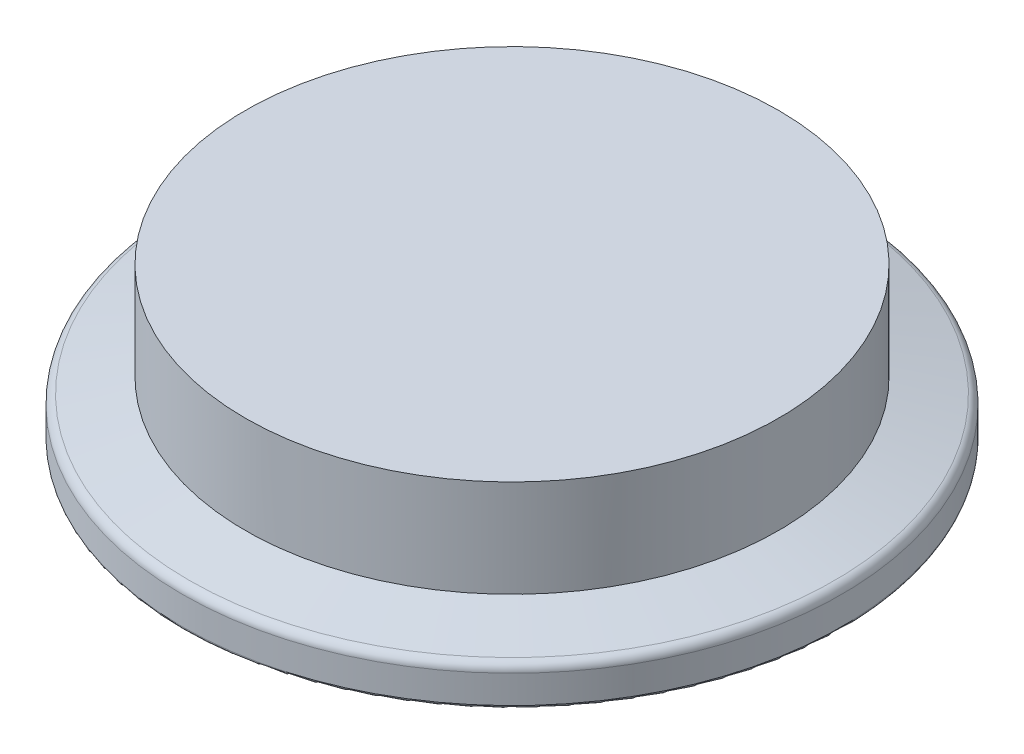
ISO-10303-21;
HEADER;
FILE_DESCRIPTION(('STEP AP214'),'2;1');
FILE_NAME('part.step','',(''),(''),'','','');
FILE_SCHEMA(('AUTOMOTIVE_DESIGN { 1 0 10303 214 1 1 1 1 }'));
ENDSEC;
DATA;
#1=APPLICATION_CONTEXT('core data for automotive mechanical design processes');
#2=APPLICATION_PROTOCOL_DEFINITION('international standard','automotive_design',2000,#1);
#3=PRODUCT_CONTEXT('',#1,'mechanical');
#4=PRODUCT('Part','Part','',(#3));
#5=PRODUCT_RELATED_PRODUCT_CATEGORY('part','',(#4));
#6=PRODUCT_DEFINITION_FORMATION('','',#4);
#7=PRODUCT_DEFINITION_CONTEXT('part definition',#1,'design');
#8=PRODUCT_DEFINITION('design','',#6,#7);
#9=PRODUCT_DEFINITION_SHAPE('','',#8);
#10=(LENGTH_UNIT() NAMED_UNIT(*) SI_UNIT(.MILLI.,.METRE.));
#11=(NAMED_UNIT(*) PLANE_ANGLE_UNIT() SI_UNIT($,.RADIAN.));
#12=(NAMED_UNIT(*) SI_UNIT($,.STERADIAN.) SOLID_ANGLE_UNIT());
#13=UNCERTAINTY_MEASURE_WITH_UNIT(LENGTH_MEASURE(1.E-05),#10,'distance_accuracy_value','');
#14=(GEOMETRIC_REPRESENTATION_CONTEXT(3) GLOBAL_UNCERTAINTY_ASSIGNED_CONTEXT((#13)) GLOBAL_UNIT_ASSIGNED_CONTEXT((#10,
#11,#12)) REPRESENTATION_CONTEXT('',''));
#15=CARTESIAN_POINT('',(0.,0.,0.));
#16=DIRECTION('',(0.,0.,1.));
#17=DIRECTION('',(1.,0.,0.));
#18=AXIS2_PLACEMENT_3D('',#15,#16,#17);
#19=CARTESIAN_POINT('',(0.,0.,20.625));
#20=DIRECTION('',(0.,1.,0.));
#21=DIRECTION('',(0.,0.,1.));
#22=AXIS2_PLACEMENT_3D('',#19,#20,#21);
#23=PLANE('',#22);
#24=CARTESIAN_POINT('',(0.,0.,0.));
#25=DIRECTION('',(0.,1.,0.));
#26=DIRECTION('',(0.,0.,1.));
#27=AXIS2_PLACEMENT_3D('',#24,#25,#26);
#28=CIRCLE('',#27,27.246);
#29=CARTESIAN_POINT('',(0.,0.,27.246));
#30=VERTEX_POINT('',#29);
#31=EDGE_CURVE('E43',#30,#30,#28,.F.);
#32=ORIENTED_EDGE('',*,*,#31,.T.);
#33=EDGE_LOOP('',(#32));
#34=FACE_BOUND('',#33,.T.);
#35=CARTESIAN_POINT('',(0.,0.,0.));
#36=DIRECTION('',(0.,-1.,0.));
#37=DIRECTION('',(0.,0.,-1.));
#38=AXIS2_PLACEMENT_3D('',#35,#36,#37);
#39=CIRCLE('',#38,20.625);
#40=CARTESIAN_POINT('',(0.,0.,-20.625));
#41=VERTEX_POINT('',#40);
#42=EDGE_CURVE('E64',#41,#41,#39,.T.);
#43=ORIENTED_EDGE('',*,*,#42,.F.);
#44=EDGE_LOOP('',(#43));
#45=FACE_BOUND('',#44,.T.);
#46=ADVANCED_FACE('F36',(#34,#45),#23,.F.);
#47=CARTESIAN_POINT('',(0.,0.,0.));
#48=DIRECTION('',(0.,-1.,0.));
#49=DIRECTION('',(0.,0.,-1.));
#50=AXIS2_PLACEMENT_3D('',#47,#48,#49);
#51=CYLINDRICAL_SURFACE('',#50,27.5);
#52=CARTESIAN_POINT('',(0.,0.253999999999999,0.));
#53=DIRECTION('',(0.,1.,0.));
#54=DIRECTION('',(0.,0.,1.));
#55=AXIS2_PLACEMENT_3D('',#52,#53,#54);
#56=CIRCLE('',#55,27.5);
#57=CARTESIAN_POINT('',(0.,0.253999999999999,27.5));
#58=VERTEX_POINT('',#57);
#59=EDGE_CURVE('E11',#58,#58,#56,.T.);
#60=ORIENTED_EDGE('',*,*,#59,.T.);
#61=EDGE_LOOP('',(#60));
#62=FACE_BOUND('',#61,.T.);
#63=CARTESIAN_POINT('',(0.,2.59029683516003,0.));
#64=DIRECTION('',(0.,1.,0.));
#65=DIRECTION('',(0.,0.,1.));
#66=AXIS2_PLACEMENT_3D('',#63,#64,#65);
#67=CIRCLE('',#66,27.5);
#68=CARTESIAN_POINT('',(0.,2.59029683516003,27.5));
#69=VERTEX_POINT('',#68);
#70=EDGE_CURVE('E51',#69,#69,#67,.F.);
#71=ORIENTED_EDGE('',*,*,#70,.T.);
#72=EDGE_LOOP('',(#71));
#73=FACE_BOUND('',#72,.T.);
#74=ADVANCED_FACE('F91',(#62,#73),#51,.T.);
#75=CARTESIAN_POINT('',(0.,5.1,0.));
#76=DIRECTION('',(0.,-1.,0.));
#77=DIRECTION('',(0.,0.,-1.));
#78=AXIS2_PLACEMENT_3D('',#75,#76,#77);
#79=CONICAL_SURFACE('',#78,20.3158021954298,1.30899693899575);
#80=CARTESIAN_POINT('',(0.,3.3263323147923,0.));
#81=DIRECTION('',(0.,1.,0.));
#82=DIRECTION('',(0.,0.,1.));
#83=AXIS2_PLACEMENT_3D('',#80,#81,#82);
#84=CIRCLE('',#83,26.9352201123681);
#85=CARTESIAN_POINT('',(0.,3.3263323147923,26.9352201123681));
#86=VERTEX_POINT('',#85);
#87=EDGE_CURVE('E47',#86,#86,#84,.T.);
#88=ORIENTED_EDGE('',*,*,#87,.T.);
#89=EDGE_LOOP('',(#88));
#90=FACE_BOUND('',#89,.T.);
#91=CARTESIAN_POINT('',(0.,4.58173326026338,0.));
#92=DIRECTION('',(0.,-1.,0.));
#93=DIRECTION('',(0.,0.,-1.));
#94=AXIS2_PLACEMENT_3D('',#91,#92,#93);
#95=CIRCLE('',#94,22.25);
#96=CARTESIAN_POINT('',(0.,4.58173326026338,-22.25));
#97=VERTEX_POINT('',#96);
#98=EDGE_CURVE('E57',#97,#97,#95,.T.);
#99=ORIENTED_EDGE('',*,*,#98,.T.);
#100=EDGE_LOOP('',(#99));
#101=FACE_BOUND('',#100,.T.);
#102=ADVANCED_FACE('F96',(#90,#101),#79,.T.);
#103=CARTESIAN_POINT('',(0.,2.5,0.));
#104=DIRECTION('',(0.,1.,0.));
#105=DIRECTION('',(0.,0.,1.));
#106=AXIS2_PLACEMENT_3D('',#103,#104,#105);
#107=PLANE('',#106);
#108=CARTESIAN_POINT('',(0.,2.5,0.));
#109=DIRECTION('',(0.,1.,0.));
#110=DIRECTION('',(0.,0.,1.));
#111=AXIS2_PLACEMENT_3D('',#108,#109,#110);
#112=CIRCLE('',#111,15.85);
#113=CARTESIAN_POINT('',(0.,2.5,15.85));
#114=VERTEX_POINT('',#113);
#115=EDGE_CURVE('E67',#114,#114,#112,.T.);
#116=ORIENTED_EDGE('',*,*,#115,.T.);
#117=EDGE_LOOP('',(#116));
#118=FACE_BOUND('',#117,.T.);
#119=CARTESIAN_POINT('',(0.,2.5,0.));
#120=DIRECTION('',(0.,-1.,0.));
#121=DIRECTION('',(0.,0.,-1.));
#122=AXIS2_PLACEMENT_3D('',#119,#120,#121);
#123=CIRCLE('',#122,20.625);
#124=CARTESIAN_POINT('',(0.,2.5,-20.625));
#125=VERTEX_POINT('',#124);
#126=EDGE_CURVE('E56',#125,#125,#123,.T.);
#127=ORIENTED_EDGE('',*,*,#126,.T.);
#128=EDGE_LOOP('',(#127));
#129=FACE_BOUND('',#128,.T.);
#130=ADVANCED_FACE('F102',(#118,#129),#107,.F.);
#131=CARTESIAN_POINT('',(0.,0.,0.));
#132=DIRECTION('',(0.,-1.,0.));
#133=DIRECTION('',(0.,0.,-1.));
#134=AXIS2_PLACEMENT_3D('',#131,#132,#133);
#135=CYLINDRICAL_SURFACE('',#134,20.625);
#136=ORIENTED_EDGE('',*,*,#126,.F.);
#137=EDGE_LOOP('',(#136));
#138=FACE_BOUND('',#137,.T.);
#139=ORIENTED_EDGE('',*,*,#42,.T.);
#140=EDGE_LOOP('',(#139));
#141=FACE_BOUND('',#140,.T.);
#142=ADVANCED_FACE('F106',(#138,#141),#135,.F.);
#143=CARTESIAN_POINT('',(0.,0.,0.));
#144=DIRECTION('',(0.,1.,0.));
#145=DIRECTION('',(0.,0.,1.));
#146=AXIS2_PLACEMENT_3D('',#143,#144,#145);
#147=CYLINDRICAL_SURFACE('',#146,15.85);
#148=CARTESIAN_POINT('',(0.,0.,0.));
#149=DIRECTION('',(0.,1.,0.));
#150=DIRECTION('',(0.,0.,1.));
#151=AXIS2_PLACEMENT_3D('',#148,#149,#150);
#152=CIRCLE('',#151,15.85);
#153=CARTESIAN_POINT('',(0.,0.,15.85));
#154=VERTEX_POINT('',#153);
#155=EDGE_CURVE('E60',#154,#154,#152,.T.);
#156=ORIENTED_EDGE('',*,*,#155,.T.);
#157=EDGE_LOOP('',(#156));
#158=FACE_BOUND('',#157,.T.);
#159=ORIENTED_EDGE('',*,*,#115,.F.);
#160=EDGE_LOOP('',(#159));
#161=FACE_BOUND('',#160,.T.);
#162=ADVANCED_FACE('F110',(#158,#161),#147,.T.);
#163=CARTESIAN_POINT('',(0.,0.,0.));
#164=DIRECTION('',(0.,-1.,0.));
#165=DIRECTION('',(0.,0.,-1.));
#166=AXIS2_PLACEMENT_3D('',#163,#164,#165);
#167=PLANE('',#166);
#168=ORIENTED_EDGE('',*,*,#155,.F.);
#169=EDGE_LOOP('',(#168));
#170=FACE_BOUND('',#169,.T.);
#171=ADVANCED_FACE('F87',(#170),#167,.T.);
#172=CARTESIAN_POINT('',(0.,88.3325035256027,0.));
#173=DIRECTION('',(0.,-1.,0.));
#174=DIRECTION('',(0.,0.,-1.));
#175=AXIS2_PLACEMENT_3D('',#172,#173,#174);
#176=CYLINDRICAL_SURFACE('',#175,22.25);
#177=CARTESIAN_POINT('',(0.,12.7,0.));
#178=DIRECTION('',(0.,1.,0.));
#179=DIRECTION('',(0.,0.,1.));
#180=AXIS2_PLACEMENT_3D('',#177,#178,#179);
#181=CIRCLE('',#180,22.25);
#182=CARTESIAN_POINT('',(0.,12.7,22.25));
#183=VERTEX_POINT('',#182);
#184=EDGE_CURVE('E61',#183,#183,#181,.F.);
#185=ORIENTED_EDGE('',*,*,#184,.T.);
#186=EDGE_LOOP('',(#185));
#187=FACE_BOUND('',#186,.T.);
#188=ORIENTED_EDGE('',*,*,#98,.F.);
#189=EDGE_LOOP('',(#188));
#190=FACE_BOUND('',#189,.T.);
#191=ADVANCED_FACE('F75',(#187,#190),#176,.T.);
#192=CARTESIAN_POINT('',(0.,12.7,20.625));
#193=DIRECTION('',(0.,1.,0.));
#194=DIRECTION('',(0.,0.,1.));
#195=AXIS2_PLACEMENT_3D('',#192,#193,#194);
#196=PLANE('',#195);
#197=ORIENTED_EDGE('',*,*,#184,.F.);
#198=EDGE_LOOP('',(#197));
#199=FACE_BOUND('',#198,.T.);
#200=ADVANCED_FACE('F78',(#199),#196,.T.);
#201=CARTESIAN_POINT('',(0.,2.59029683516003,0.));
#202=DIRECTION('',(0.,1.,0.));
#203=DIRECTION('',(0.,0.,1.));
#204=AXIS2_PLACEMENT_3D('',#201,#202,#203);
#205=TOROIDAL_SURFACE('',#204,26.738,0.762);
#206=ORIENTED_EDGE('',*,*,#87,.F.);
#207=EDGE_LOOP('',(#206));
#208=FACE_BOUND('',#207,.T.);
#209=ORIENTED_EDGE('',*,*,#70,.F.);
#210=EDGE_LOOP('',(#209));
#211=FACE_BOUND('',#210,.T.);
#212=ADVANCED_FACE('F80',(#208,#211),#205,.T.);
#213=CARTESIAN_POINT('',(0.,0.253999999999999,0.));
#214=DIRECTION('',(0.,1.,0.));
#215=DIRECTION('',(0.,0.,1.));
#216=AXIS2_PLACEMENT_3D('',#213,#214,#215);
#217=TOROIDAL_SURFACE('',#216,27.246,0.254);
#218=ORIENTED_EDGE('',*,*,#59,.F.);
#219=EDGE_LOOP('',(#218));
#220=FACE_BOUND('',#219,.T.);
#221=ORIENTED_EDGE('',*,*,#31,.F.);
#222=EDGE_LOOP('',(#221));
#223=FACE_BOUND('',#222,.T.);
#224=ADVANCED_FACE('F38',(#220,#223),#217,.T.);
#225=CLOSED_SHELL('',(#46,#74,#102,#130,#142,#162,#171,#191,#200,#212,#224));
#226=MANIFOLD_SOLID_BREP('B2',#225);
#227=ADVANCED_BREP_SHAPE_REPRESENTATION('',(#18,#226),#14);
#228=SHAPE_DEFINITION_REPRESENTATION(#9,#227);
ENDSEC;
END-ISO-10303-21;
